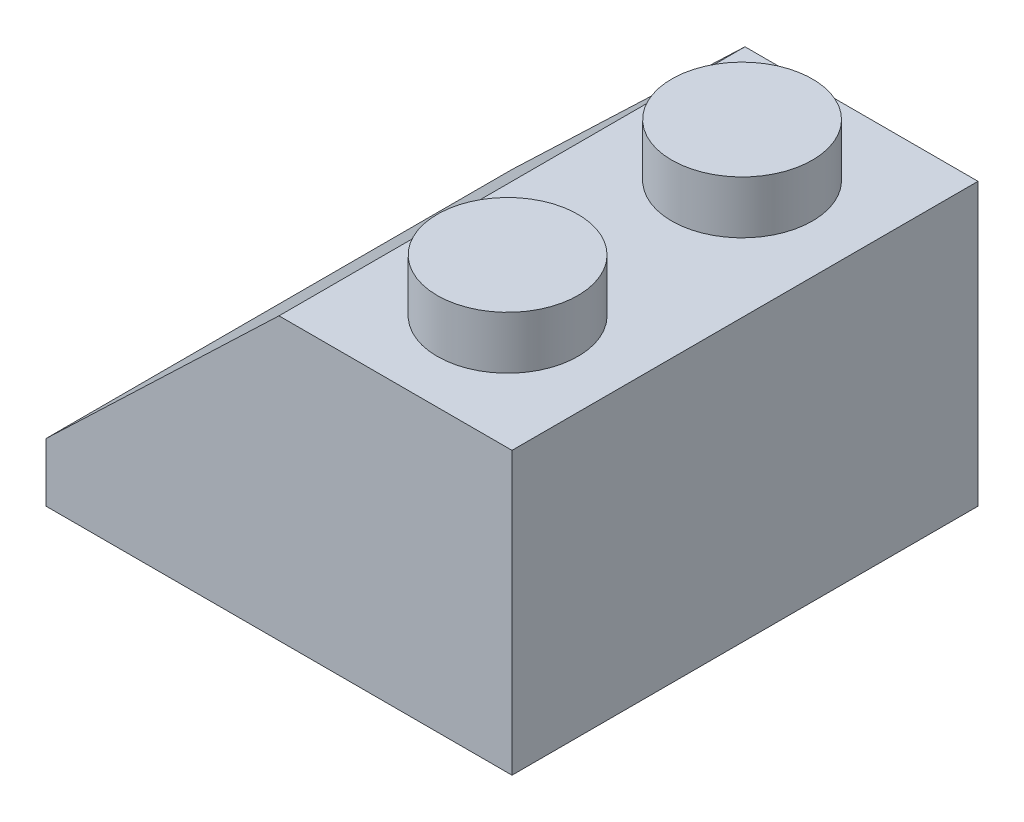
ISO-10303-21;
HEADER;
FILE_DESCRIPTION(('STEP AP214'),'2;1');
FILE_NAME('part.step','',(''),(''),'','','');
FILE_SCHEMA(('AUTOMOTIVE_DESIGN { 1 0 10303 214 1 1 1 1 }'));
ENDSEC;
DATA;
#1=APPLICATION_CONTEXT('core data for automotive mechanical design processes');
#2=APPLICATION_PROTOCOL_DEFINITION('international standard','automotive_design',2000,#1);
#3=PRODUCT_CONTEXT('',#1,'mechanical');
#4=PRODUCT('Part','Part','',(#3));
#5=PRODUCT_RELATED_PRODUCT_CATEGORY('part','',(#4));
#6=PRODUCT_DEFINITION_FORMATION('','',#4);
#7=PRODUCT_DEFINITION_CONTEXT('part definition',#1,'design');
#8=PRODUCT_DEFINITION('design','',#6,#7);
#9=PRODUCT_DEFINITION_SHAPE('','',#8);
#10=(LENGTH_UNIT() NAMED_UNIT(*) SI_UNIT(.MILLI.,.METRE.));
#11=(NAMED_UNIT(*) PLANE_ANGLE_UNIT() SI_UNIT($,.RADIAN.));
#12=(NAMED_UNIT(*) SI_UNIT($,.STERADIAN.) SOLID_ANGLE_UNIT());
#13=UNCERTAINTY_MEASURE_WITH_UNIT(LENGTH_MEASURE(1.E-05),#10,'distance_accuracy_value','');
#14=(GEOMETRIC_REPRESENTATION_CONTEXT(3) GLOBAL_UNCERTAINTY_ASSIGNED_CONTEXT((#13)) GLOBAL_UNIT_ASSIGNED_CONTEXT((#10,
#11,#12)) REPRESENTATION_CONTEXT('',''));
#15=CARTESIAN_POINT('',(0.,0.,0.));
#16=DIRECTION('',(0.,0.,1.));
#17=DIRECTION('',(1.,0.,0.));
#18=AXIS2_PLACEMENT_3D('',#15,#16,#17);
#19=CARTESIAN_POINT('',(0.,0.,-7.95));
#20=DIRECTION('',(0.,-1.,0.));
#21=DIRECTION('',(1.,0.,0.));
#22=AXIS2_PLACEMENT_3D('',#19,#20,#21);
#23=PLANE('',#22);
#24=DIRECTION('',(1.,0.,0.));
#25=VECTOR('',#24,1.);
#26=CARTESIAN_POINT('',(0.,0.,7.95));
#27=LINE('',#26,#25);
#28=CARTESIAN_POINT('',(-15.9,0.,7.95));
#29=VERTEX_POINT('',#28);
#30=CARTESIAN_POINT('',(0.,0.,7.95));
#31=VERTEX_POINT('',#30);
#32=EDGE_CURVE('E221',#29,#31,#27,.T.);
#33=ORIENTED_EDGE('',*,*,#32,.F.);
#34=DIRECTION('',(0.,0.,1.));
#35=VECTOR('',#34,1.);
#36=CARTESIAN_POINT('',(-15.9,0.,-7.95));
#37=LINE('',#36,#35);
#38=CARTESIAN_POINT('',(-15.9,0.,-7.95));
#39=VERTEX_POINT('',#38);
#40=EDGE_CURVE('E49',#39,#29,#37,.T.);
#41=ORIENTED_EDGE('',*,*,#40,.F.);
#42=DIRECTION('',(1.,0.,0.));
#43=VECTOR('',#42,1.);
#44=CARTESIAN_POINT('',(0.,0.,-7.95));
#45=LINE('',#44,#43);
#46=CARTESIAN_POINT('',(0.,0.,-7.95));
#47=VERTEX_POINT('',#46);
#48=EDGE_CURVE('E233',#39,#47,#45,.T.);
#49=ORIENTED_EDGE('',*,*,#48,.T.);
#50=DIRECTION('',(0.,0.,1.));
#51=VECTOR('',#50,1.);
#52=CARTESIAN_POINT('',(0.,0.,-7.95));
#53=LINE('',#52,#51);
#54=EDGE_CURVE('E11',#47,#31,#53,.T.);
#55=ORIENTED_EDGE('',*,*,#54,.T.);
#56=EDGE_LOOP('',(#33,#41,#49,#55));
#57=FACE_BOUND('',#56,.T.);
#58=DIRECTION('',(0.,0.,1.));
#59=VECTOR('',#58,1.);
#60=CARTESIAN_POINT('',(-15.4,0.,-7.95));
#61=LINE('',#60,#59);
#62=CARTESIAN_POINT('',(-15.4,0.,-7.45));
#63=VERTEX_POINT('',#62);
#64=CARTESIAN_POINT('',(-15.4,0.,7.45));
#65=VERTEX_POINT('',#64);
#66=EDGE_CURVE('E168',#63,#65,#61,.T.);
#67=ORIENTED_EDGE('',*,*,#66,.T.);
#68=DIRECTION('',(1.,0.,0.));
#69=VECTOR('',#68,1.);
#70=CARTESIAN_POINT('',(0.,0.,7.45));
#71=LINE('',#70,#69);
#72=CARTESIAN_POINT('',(-0.5,0.,7.45));
#73=VERTEX_POINT('',#72);
#74=EDGE_CURVE('E171',#65,#73,#71,.T.);
#75=ORIENTED_EDGE('',*,*,#74,.T.);
#76=DIRECTION('',(0.,0.,1.));
#77=VECTOR('',#76,1.);
#78=CARTESIAN_POINT('',(-0.5,0.,-7.95));
#79=LINE('',#78,#77);
#80=CARTESIAN_POINT('',(-0.5,0.,-7.45));
#81=VERTEX_POINT('',#80);
#82=EDGE_CURVE('E187',#81,#73,#79,.T.);
#83=ORIENTED_EDGE('',*,*,#82,.F.);
#84=DIRECTION('',(1.,0.,0.));
#85=VECTOR('',#84,1.);
#86=CARTESIAN_POINT('',(0.,0.,-7.45));
#87=LINE('',#86,#85);
#88=EDGE_CURVE('E175',#63,#81,#87,.T.);
#89=ORIENTED_EDGE('',*,*,#88,.F.);
#90=EDGE_LOOP('',(#67,#75,#83,#89));
#91=FACE_BOUND('',#90,.T.);
#92=ADVANCED_FACE('F39',(#57,#91),#23,.T.);
#93=CARTESIAN_POINT('',(0.,9.6,-7.95));
#94=DIRECTION('',(1.,0.,0.));
#95=DIRECTION('',(0.,1.,0.));
#96=AXIS2_PLACEMENT_3D('',#93,#94,#95);
#97=PLANE('',#96);
#98=DIRECTION('',(0.,1.,0.));
#99=VECTOR('',#98,1.);
#100=CARTESIAN_POINT('',(0.,9.6,7.95));
#101=LINE('',#100,#99);
#102=CARTESIAN_POINT('',(0.,9.6,7.95));
#103=VERTEX_POINT('',#102);
#104=EDGE_CURVE('E212',#31,#103,#101,.T.);
#105=ORIENTED_EDGE('',*,*,#104,.F.);
#106=ORIENTED_EDGE('',*,*,#54,.F.);
#107=DIRECTION('',(0.,1.,0.));
#108=VECTOR('',#107,1.);
#109=CARTESIAN_POINT('',(0.,9.6,-7.95));
#110=LINE('',#109,#108);
#111=CARTESIAN_POINT('',(0.,9.6,-7.95));
#112=VERTEX_POINT('',#111);
#113=EDGE_CURVE('E216',#47,#112,#110,.T.);
#114=ORIENTED_EDGE('',*,*,#113,.T.);
#115=DIRECTION('',(0.,0.,1.));
#116=VECTOR('',#115,1.);
#117=CARTESIAN_POINT('',(0.,9.6,-7.95));
#118=LINE('',#117,#116);
#119=EDGE_CURVE('E43',#112,#103,#118,.T.);
#120=ORIENTED_EDGE('',*,*,#119,.T.);
#121=EDGE_LOOP('',(#105,#106,#114,#120));
#122=FACE_BOUND('',#121,.T.);
#123=ADVANCED_FACE('F41',(#122),#97,.T.);
#124=CARTESIAN_POINT('',(-15.9,0.,-7.95));
#125=DIRECTION('',(-1.,0.,0.));
#126=DIRECTION('',(0.,0.,1.));
#127=AXIS2_PLACEMENT_3D('',#124,#125,#126);
#128=PLANE('',#127);
#129=DIRECTION('',(0.,-1.,0.));
#130=VECTOR('',#129,1.);
#131=CARTESIAN_POINT('',(-15.9,0.,7.95));
#132=LINE('',#131,#130);
#133=CARTESIAN_POINT('',(-15.9,2.,7.95));
#134=VERTEX_POINT('',#133);
#135=EDGE_CURVE('E248',#134,#29,#132,.T.);
#136=ORIENTED_EDGE('',*,*,#135,.F.);
#137=DIRECTION('',(0.,0.,1.));
#138=VECTOR('',#137,1.);
#139=CARTESIAN_POINT('',(-15.9,2.,-7.95));
#140=LINE('',#139,#138);
#141=CARTESIAN_POINT('',(-15.9,2.,-7.95));
#142=VERTEX_POINT('',#141);
#143=EDGE_CURVE('E257',#142,#134,#140,.T.);
#144=ORIENTED_EDGE('',*,*,#143,.F.);
#145=DIRECTION('',(0.,-1.,0.));
#146=VECTOR('',#145,1.);
#147=CARTESIAN_POINT('',(-15.9,0.,-7.95));
#148=LINE('',#147,#146);
#149=EDGE_CURVE('E229',#142,#39,#148,.T.);
#150=ORIENTED_EDGE('',*,*,#149,.T.);
#151=ORIENTED_EDGE('',*,*,#40,.T.);
#152=EDGE_LOOP('',(#136,#144,#150,#151));
#153=FACE_BOUND('',#152,.T.);
#154=ADVANCED_FACE('F284',(#153),#128,.T.);
#155=CARTESIAN_POINT('',(-15.9,2.,-7.95));
#156=DIRECTION('',(-0.691016178160011,0.722839291627906,0.));
#157=DIRECTION('',(-0.722839291627906,-0.691016178160011,0.));
#158=AXIS2_PLACEMENT_3D('',#155,#156,#157);
#159=PLANE('',#158);
#160=DIRECTION('',(-0.722839291627906,-0.691016178160011,0.));
#161=VECTOR('',#160,1.);
#162=CARTESIAN_POINT('',(-15.9,2.,7.95));
#163=LINE('',#162,#161);
#164=CARTESIAN_POINT('',(-7.95,9.6,7.95));
#165=VERTEX_POINT('',#164);
#166=EDGE_CURVE('E244',#165,#134,#163,.T.);
#167=ORIENTED_EDGE('',*,*,#166,.F.);
#168=DIRECTION('',(0.,0.,1.));
#169=VECTOR('',#168,1.);
#170=CARTESIAN_POINT('',(-7.95,9.6,-7.95));
#171=LINE('',#170,#169);
#172=CARTESIAN_POINT('',(-7.95,9.6,-7.95));
#173=VERTEX_POINT('',#172);
#174=EDGE_CURVE('E259',#173,#165,#171,.T.);
#175=ORIENTED_EDGE('',*,*,#174,.F.);
#176=DIRECTION('',(-0.722839291627906,-0.691016178160011,0.));
#177=VECTOR('',#176,1.);
#178=CARTESIAN_POINT('',(-15.9,2.,-7.95));
#179=LINE('',#178,#177);
#180=EDGE_CURVE('E225',#173,#142,#179,.T.);
#181=ORIENTED_EDGE('',*,*,#180,.T.);
#182=ORIENTED_EDGE('',*,*,#143,.T.);
#183=EDGE_LOOP('',(#167,#175,#181,#182));
#184=FACE_BOUND('',#183,.T.);
#185=ADVANCED_FACE('F282',(#184),#159,.T.);
#186=CARTESIAN_POINT('',(-7.95,9.6,-7.95));
#187=DIRECTION('',(0.,1.,0.));
#188=DIRECTION('',(0.,0.,1.));
#189=AXIS2_PLACEMENT_3D('',#186,#187,#188);
#190=PLANE('',#189);
#191=CARTESIAN_POINT('',(-4.05,9.6,-3.95));
#192=DIRECTION('',(0.,1.,0.));
#193=DIRECTION('',(0.,0.,1.));
#194=AXIS2_PLACEMENT_3D('',#191,#192,#193);
#195=CIRCLE('',#194,2.4);
#196=CARTESIAN_POINT('',(-4.05,9.6,-1.55));
#197=VERTEX_POINT('',#196);
#198=EDGE_CURVE('E190',#197,#197,#195,.T.);
#199=ORIENTED_EDGE('',*,*,#198,.F.);
#200=EDGE_LOOP('',(#199));
#201=FACE_BOUND('',#200,.T.);
#202=CARTESIAN_POINT('',(-4.05,9.6,4.05));
#203=DIRECTION('',(0.,1.,0.));
#204=DIRECTION('',(0.,0.,1.));
#205=AXIS2_PLACEMENT_3D('',#202,#203,#204);
#206=CIRCLE('',#205,2.4);
#207=CARTESIAN_POINT('',(-4.05,9.6,6.45));
#208=VERTEX_POINT('',#207);
#209=EDGE_CURVE('E207',#208,#208,#206,.T.);
#210=ORIENTED_EDGE('',*,*,#209,.F.);
#211=EDGE_LOOP('',(#210));
#212=FACE_BOUND('',#211,.T.);
#213=DIRECTION('',(-1.,0.,0.));
#214=VECTOR('',#213,1.);
#215=CARTESIAN_POINT('',(-7.95,9.6,7.95));
#216=LINE('',#215,#214);
#217=EDGE_CURVE('E240',#103,#165,#216,.T.);
#218=ORIENTED_EDGE('',*,*,#217,.F.);
#219=ORIENTED_EDGE('',*,*,#119,.F.);
#220=DIRECTION('',(-1.,0.,0.));
#221=VECTOR('',#220,1.);
#222=CARTESIAN_POINT('',(-7.95,9.6,-7.95));
#223=LINE('',#222,#221);
#224=EDGE_CURVE('E220',#112,#173,#223,.T.);
#225=ORIENTED_EDGE('',*,*,#224,.T.);
#226=ORIENTED_EDGE('',*,*,#174,.T.);
#227=EDGE_LOOP('',(#218,#219,#225,#226));
#228=FACE_BOUND('',#227,.T.);
#229=ADVANCED_FACE('F269',(#201,#212,#228),#190,.T.);
#230=CARTESIAN_POINT('',(0.,0.,-7.95));
#231=DIRECTION('',(0.,0.,-1.));
#232=DIRECTION('',(-1.,0.,0.));
#233=AXIS2_PLACEMENT_3D('',#230,#231,#232);
#234=PLANE('',#233);
#235=ORIENTED_EDGE('',*,*,#113,.F.);
#236=ORIENTED_EDGE('',*,*,#48,.F.);
#237=ORIENTED_EDGE('',*,*,#149,.F.);
#238=ORIENTED_EDGE('',*,*,#180,.F.);
#239=ORIENTED_EDGE('',*,*,#224,.F.);
#240=EDGE_LOOP('',(#235,#236,#237,#238,#239));
#241=FACE_BOUND('',#240,.T.);
#242=ADVANCED_FACE('F278',(#241),#234,.T.);
#243=CARTESIAN_POINT('',(0.,0.,7.95));
#244=DIRECTION('',(0.,0.,-1.));
#245=DIRECTION('',(-1.,0.,0.));
#246=AXIS2_PLACEMENT_3D('',#243,#244,#245);
#247=PLANE('',#246);
#248=ORIENTED_EDGE('',*,*,#104,.T.);
#249=ORIENTED_EDGE('',*,*,#217,.T.);
#250=ORIENTED_EDGE('',*,*,#166,.T.);
#251=ORIENTED_EDGE('',*,*,#135,.T.);
#252=ORIENTED_EDGE('',*,*,#32,.T.);
#253=EDGE_LOOP('',(#248,#249,#250,#251,#252));
#254=FACE_BOUND('',#253,.T.);
#255=ADVANCED_FACE('F271',(#254),#247,.F.);
#256=CARTESIAN_POINT('',(-4.05,11.4,4.05));
#257=DIRECTION('',(0.,-1.,0.));
#258=DIRECTION('',(0.,0.,-1.));
#259=AXIS2_PLACEMENT_3D('',#256,#257,#258);
#260=CYLINDRICAL_SURFACE('',#259,2.4);
#261=CARTESIAN_POINT('',(-4.05,11.4,4.05));
#262=DIRECTION('',(0.,1.,0.));
#263=DIRECTION('',(0.,0.,1.));
#264=AXIS2_PLACEMENT_3D('',#261,#262,#263);
#265=CIRCLE('',#264,2.4);
#266=CARTESIAN_POINT('',(-4.05,11.4,6.45));
#267=VERTEX_POINT('',#266);
#268=EDGE_CURVE('E208',#267,#267,#265,.T.);
#269=ORIENTED_EDGE('',*,*,#268,.F.);
#270=EDGE_LOOP('',(#269));
#271=FACE_BOUND('',#270,.T.);
#272=ORIENTED_EDGE('',*,*,#209,.T.);
#273=EDGE_LOOP('',(#272));
#274=FACE_BOUND('',#273,.T.);
#275=ADVANCED_FACE('F299',(#271,#274),#260,.T.);
#276=CARTESIAN_POINT('',(-4.05,11.4,4.05));
#277=DIRECTION('',(0.,1.,0.));
#278=DIRECTION('',(0.,0.,1.));
#279=AXIS2_PLACEMENT_3D('',#276,#277,#278);
#280=PLANE('',#279);
#281=ORIENTED_EDGE('',*,*,#268,.T.);
#282=EDGE_LOOP('',(#281));
#283=FACE_BOUND('',#282,.T.);
#284=ADVANCED_FACE('F304',(#283),#280,.T.);
#285=CARTESIAN_POINT('',(-4.05,11.4,-3.95));
#286=DIRECTION('',(0.,-1.,0.));
#287=DIRECTION('',(0.,0.,-1.));
#288=AXIS2_PLACEMENT_3D('',#285,#286,#287);
#289=CYLINDRICAL_SURFACE('',#288,2.4);
#290=CARTESIAN_POINT('',(-4.05,11.4,-3.95));
#291=DIRECTION('',(0.,1.,0.));
#292=DIRECTION('',(0.,0.,1.));
#293=AXIS2_PLACEMENT_3D('',#290,#291,#292);
#294=CIRCLE('',#293,2.4);
#295=CARTESIAN_POINT('',(-4.05,11.4,-1.55));
#296=VERTEX_POINT('',#295);
#297=EDGE_CURVE('E203',#296,#296,#294,.T.);
#298=ORIENTED_EDGE('',*,*,#297,.F.);
#299=EDGE_LOOP('',(#298));
#300=FACE_BOUND('',#299,.T.);
#301=ORIENTED_EDGE('',*,*,#198,.T.);
#302=EDGE_LOOP('',(#301));
#303=FACE_BOUND('',#302,.T.);
#304=ADVANCED_FACE('F308',(#300,#303),#289,.T.);
#305=CARTESIAN_POINT('',(-4.05,11.4,-3.95));
#306=DIRECTION('',(0.,1.,0.));
#307=DIRECTION('',(0.,0.,1.));
#308=AXIS2_PLACEMENT_3D('',#305,#306,#307);
#309=PLANE('',#308);
#310=ORIENTED_EDGE('',*,*,#297,.T.);
#311=EDGE_LOOP('',(#310));
#312=FACE_BOUND('',#311,.T.);
#313=ADVANCED_FACE('F312',(#312),#309,.T.);
#314=CARTESIAN_POINT('',(-0.5,9.6,-7.95));
#315=DIRECTION('',(1.,0.,0.));
#316=DIRECTION('',(0.,1.,0.));
#317=AXIS2_PLACEMENT_3D('',#314,#315,#316);
#318=PLANE('',#317);
#319=DIRECTION('',(0.,1.,0.));
#320=VECTOR('',#319,1.);
#321=CARTESIAN_POINT('',(-0.5,9.6,7.45));
#322=LINE('',#321,#320);
#323=CARTESIAN_POINT('',(-0.5,9.1,7.45));
#324=VERTEX_POINT('',#323);
#325=EDGE_CURVE('E180',#73,#324,#322,.T.);
#326=ORIENTED_EDGE('',*,*,#325,.T.);
#327=DIRECTION('',(0.,0.,1.));
#328=VECTOR('',#327,1.);
#329=CARTESIAN_POINT('',(-0.5,9.1,-7.95));
#330=LINE('',#329,#328);
#331=CARTESIAN_POINT('',(-0.5,9.1,-7.45));
#332=VERTEX_POINT('',#331);
#333=EDGE_CURVE('E150',#332,#324,#330,.T.);
#334=ORIENTED_EDGE('',*,*,#333,.F.);
#335=DIRECTION('',(0.,1.,0.));
#336=VECTOR('',#335,1.);
#337=CARTESIAN_POINT('',(-0.5,9.6,-7.45));
#338=LINE('',#337,#336);
#339=EDGE_CURVE('E194',#81,#332,#338,.T.);
#340=ORIENTED_EDGE('',*,*,#339,.F.);
#341=ORIENTED_EDGE('',*,*,#82,.T.);
#342=EDGE_LOOP('',(#326,#334,#340,#341));
#343=FACE_BOUND('',#342,.T.);
#344=ADVANCED_FACE('F316',(#343),#318,.F.);
#345=CARTESIAN_POINT('',(-15.4,0.,-7.95));
#346=DIRECTION('',(-1.,0.,0.));
#347=DIRECTION('',(0.,0.,1.));
#348=AXIS2_PLACEMENT_3D('',#345,#346,#347);
#349=PLANE('',#348);
#350=DIRECTION('',(0.,-1.,0.));
#351=VECTOR('',#350,1.);
#352=CARTESIAN_POINT('',(-15.4,0.,7.45));
#353=LINE('',#352,#351);
#354=CARTESIAN_POINT('',(-15.4,1.78627073443661,7.45));
#355=VERTEX_POINT('',#354);
#356=EDGE_CURVE('E159',#355,#65,#353,.T.);
#357=ORIENTED_EDGE('',*,*,#356,.T.);
#358=ORIENTED_EDGE('',*,*,#66,.F.);
#359=DIRECTION('',(0.,-1.,0.));
#360=VECTOR('',#359,1.);
#361=CARTESIAN_POINT('',(-15.4,0.,-7.45));
#362=LINE('',#361,#360);
#363=CARTESIAN_POINT('',(-15.4,1.78627073443661,-7.45));
#364=VERTEX_POINT('',#363);
#365=EDGE_CURVE('E165',#364,#63,#362,.T.);
#366=ORIENTED_EDGE('',*,*,#365,.F.);
#367=DIRECTION('',(0.,0.,1.));
#368=VECTOR('',#367,1.);
#369=CARTESIAN_POINT('',(-15.4,1.78627073443661,-7.95));
#370=LINE('',#369,#368);
#371=EDGE_CURVE('E149',#364,#355,#370,.T.);
#372=ORIENTED_EDGE('',*,*,#371,.T.);
#373=EDGE_LOOP('',(#357,#358,#366,#372));
#374=FACE_BOUND('',#373,.T.);
#375=ADVANCED_FACE('F349',(#374),#349,.F.);
#376=CARTESIAN_POINT('',(-15.55449191092,1.63858035418605,-7.95));
#377=DIRECTION('',(-0.691016178160011,0.722839291627906,0.));
#378=DIRECTION('',(-0.722839291627906,-0.691016178160011,0.));
#379=AXIS2_PLACEMENT_3D('',#376,#377,#378);
#380=PLANE('',#379);
#381=CARTESIAN_POINT('',(-8.05,8.81268582877623,0.0499999999999958));
#382=DIRECTION('',(-0.691016178160011,0.722839291627906,0.));
#383=DIRECTION('',(0.722839291627906,0.691016178160011,0.));
#384=AXIS2_PLACEMENT_3D('',#381,#382,#383);
#385=ELLIPSE('',#384,4.15030012168224,3.);
#386=CARTESIAN_POINT('',(-7.74945425510145,9.1,3.03490741149928));
#387=VERTEX_POINT('',#386);
#388=CARTESIAN_POINT('',(-7.74945425510145,9.1,-2.93490741149929));
#389=VERTEX_POINT('',#388);
#390=EDGE_CURVE('E139',#387,#389,#385,.F.);
#391=ORIENTED_EDGE('',*,*,#390,.F.);
#392=DIRECTION('',(0.,0.,1.));
#393=VECTOR('',#392,1.);
#394=CARTESIAN_POINT('',(-7.74945425510145,9.1,-7.95));
#395=LINE('',#394,#393);
#396=CARTESIAN_POINT('',(-7.74945425510145,9.1,7.45));
#397=VERTEX_POINT('',#396);
#398=EDGE_CURVE('E145',#387,#397,#395,.T.);
#399=ORIENTED_EDGE('',*,*,#398,.T.);
#400=DIRECTION('',(-0.722839291627906,-0.691016178160011,0.));
#401=VECTOR('',#400,1.);
#402=CARTESIAN_POINT('',(-15.55449191092,1.63858035418605,7.45));
#403=LINE('',#402,#401);
#404=EDGE_CURVE('E155',#397,#355,#403,.T.);
#405=ORIENTED_EDGE('',*,*,#404,.T.);
#406=ORIENTED_EDGE('',*,*,#371,.F.);
#407=DIRECTION('',(-0.722839291627906,-0.691016178160011,0.));
#408=VECTOR('',#407,1.);
#409=CARTESIAN_POINT('',(-15.55449191092,1.63858035418605,-7.45));
#410=LINE('',#409,#408);
#411=CARTESIAN_POINT('',(-7.74945425510145,9.1,-7.45));
#412=VERTEX_POINT('',#411);
#413=EDGE_CURVE('E161',#412,#364,#410,.T.);
#414=ORIENTED_EDGE('',*,*,#413,.F.);
#415=EDGE_CURVE('E144',#412,#389,#395,.T.);
#416=ORIENTED_EDGE('',*,*,#415,.T.);
#417=EDGE_LOOP('',(#391,#399,#405,#406,#414,#416));
#418=FACE_BOUND('',#417,.T.);
#419=ADVANCED_FACE('F346',(#418),#380,.F.);
#420=CARTESIAN_POINT('',(-7.95,9.1,-7.95));
#421=DIRECTION('',(0.,1.,0.));
#422=DIRECTION('',(0.,0.,1.));
#423=AXIS2_PLACEMENT_3D('',#420,#421,#422);
#424=PLANE('',#423);
#425=CARTESIAN_POINT('',(-8.05,9.1,0.0499999999999958));
#426=DIRECTION('',(0.,-1.,0.));
#427=DIRECTION('',(0.,0.,-1.));
#428=AXIS2_PLACEMENT_3D('',#425,#426,#427);
#429=CIRCLE('',#428,3.);
#430=EDGE_CURVE('E64',#389,#387,#429,.T.);
#431=ORIENTED_EDGE('',*,*,#430,.F.);
#432=ORIENTED_EDGE('',*,*,#415,.F.);
#433=DIRECTION('',(-1.,0.,0.));
#434=VECTOR('',#433,1.);
#435=CARTESIAN_POINT('',(-7.95,9.1,-7.45));
#436=LINE('',#435,#434);
#437=EDGE_CURVE('E153',#332,#412,#436,.T.);
#438=ORIENTED_EDGE('',*,*,#437,.F.);
#439=ORIENTED_EDGE('',*,*,#333,.T.);
#440=DIRECTION('',(-1.,0.,0.));
#441=VECTOR('',#440,1.);
#442=CARTESIAN_POINT('',(-7.95,9.1,7.45));
#443=LINE('',#442,#441);
#444=EDGE_CURVE('E160',#324,#397,#443,.T.);
#445=ORIENTED_EDGE('',*,*,#444,.T.);
#446=ORIENTED_EDGE('',*,*,#398,.F.);
#447=EDGE_LOOP('',(#431,#432,#438,#439,#445,#446));
#448=FACE_BOUND('',#447,.T.);
#449=CARTESIAN_POINT('',(-4.05,9.1,-3.95));
#450=DIRECTION('',(0.,1.,0.));
#451=DIRECTION('',(0.,0.,1.));
#452=AXIS2_PLACEMENT_3D('',#449,#450,#451);
#453=CIRCLE('',#452,1.9);
#454=CARTESIAN_POINT('',(-4.05,9.1,-2.05));
#455=VERTEX_POINT('',#454);
#456=EDGE_CURVE('E186',#455,#455,#453,.T.);
#457=ORIENTED_EDGE('',*,*,#456,.T.);
#458=EDGE_LOOP('',(#457));
#459=FACE_BOUND('',#458,.T.);
#460=CARTESIAN_POINT('',(-4.05,9.1,4.05));
#461=DIRECTION('',(0.,1.,0.));
#462=DIRECTION('',(0.,0.,1.));
#463=AXIS2_PLACEMENT_3D('',#460,#461,#462);
#464=CIRCLE('',#463,1.9);
#465=CARTESIAN_POINT('',(-4.05,9.1,5.95));
#466=VERTEX_POINT('',#465);
#467=EDGE_CURVE('E181',#466,#466,#464,.T.);
#468=ORIENTED_EDGE('',*,*,#467,.T.);
#469=EDGE_LOOP('',(#468));
#470=FACE_BOUND('',#469,.T.);
#471=ADVANCED_FACE('F342',(#448,#459,#470),#424,.F.);
#472=CARTESIAN_POINT('',(0.,0.,-7.45));
#473=DIRECTION('',(0.,0.,-1.));
#474=DIRECTION('',(-1.,0.,0.));
#475=AXIS2_PLACEMENT_3D('',#472,#473,#474);
#476=PLANE('',#475);
#477=ORIENTED_EDGE('',*,*,#339,.T.);
#478=ORIENTED_EDGE('',*,*,#437,.T.);
#479=ORIENTED_EDGE('',*,*,#413,.T.);
#480=ORIENTED_EDGE('',*,*,#365,.T.);
#481=ORIENTED_EDGE('',*,*,#88,.T.);
#482=EDGE_LOOP('',(#477,#478,#479,#480,#481));
#483=FACE_BOUND('',#482,.T.);
#484=ADVANCED_FACE('F338',(#483),#476,.F.);
#485=CARTESIAN_POINT('',(0.,0.,7.45));
#486=DIRECTION('',(0.,0.,-1.));
#487=DIRECTION('',(-1.,0.,0.));
#488=AXIS2_PLACEMENT_3D('',#485,#486,#487);
#489=PLANE('',#488);
#490=ORIENTED_EDGE('',*,*,#325,.F.);
#491=ORIENTED_EDGE('',*,*,#74,.F.);
#492=ORIENTED_EDGE('',*,*,#356,.F.);
#493=ORIENTED_EDGE('',*,*,#404,.F.);
#494=ORIENTED_EDGE('',*,*,#444,.F.);
#495=EDGE_LOOP('',(#490,#491,#492,#493,#494));
#496=FACE_BOUND('',#495,.T.);
#497=ADVANCED_FACE('F334',(#496),#489,.T.);
#498=CARTESIAN_POINT('',(-4.05,11.4,4.05));
#499=DIRECTION('',(0.,-1.,0.));
#500=DIRECTION('',(0.,0.,-1.));
#501=AXIS2_PLACEMENT_3D('',#498,#499,#500);
#502=CYLINDRICAL_SURFACE('',#501,1.9);
#503=CARTESIAN_POINT('',(-4.05,10.9,4.05));
#504=DIRECTION('',(0.,1.,0.));
#505=DIRECTION('',(0.,0.,1.));
#506=AXIS2_PLACEMENT_3D('',#503,#504,#505);
#507=CIRCLE('',#506,1.9);
#508=CARTESIAN_POINT('',(-4.05,10.9,5.95));
#509=VERTEX_POINT('',#508);
#510=EDGE_CURVE('E176',#509,#509,#507,.T.);
#511=ORIENTED_EDGE('',*,*,#510,.T.);
#512=EDGE_LOOP('',(#511));
#513=FACE_BOUND('',#512,.T.);
#514=ORIENTED_EDGE('',*,*,#467,.F.);
#515=EDGE_LOOP('',(#514));
#516=FACE_BOUND('',#515,.T.);
#517=ADVANCED_FACE('F330',(#513,#516),#502,.F.);
#518=CARTESIAN_POINT('',(-4.05,10.9,4.05));
#519=DIRECTION('',(0.,1.,0.));
#520=DIRECTION('',(0.,0.,1.));
#521=AXIS2_PLACEMENT_3D('',#518,#519,#520);
#522=PLANE('',#521);
#523=ORIENTED_EDGE('',*,*,#510,.F.);
#524=EDGE_LOOP('',(#523));
#525=FACE_BOUND('',#524,.T.);
#526=ADVANCED_FACE('F326',(#525),#522,.F.);
#527=CARTESIAN_POINT('',(-4.05,11.4,-3.95));
#528=DIRECTION('',(0.,-1.,0.));
#529=DIRECTION('',(0.,0.,-1.));
#530=AXIS2_PLACEMENT_3D('',#527,#528,#529);
#531=CYLINDRICAL_SURFACE('',#530,1.9);
#532=CARTESIAN_POINT('',(-4.05,10.9,-3.95));
#533=DIRECTION('',(0.,1.,0.));
#534=DIRECTION('',(0.,0.,1.));
#535=AXIS2_PLACEMENT_3D('',#532,#533,#534);
#536=CIRCLE('',#535,1.9);
#537=CARTESIAN_POINT('',(-4.05,10.9,-2.05));
#538=VERTEX_POINT('',#537);
#539=EDGE_CURVE('E182',#538,#538,#536,.T.);
#540=ORIENTED_EDGE('',*,*,#539,.T.);
#541=EDGE_LOOP('',(#540));
#542=FACE_BOUND('',#541,.T.);
#543=ORIENTED_EDGE('',*,*,#456,.F.);
#544=EDGE_LOOP('',(#543));
#545=FACE_BOUND('',#544,.T.);
#546=ADVANCED_FACE('F322',(#542,#545),#531,.F.);
#547=CARTESIAN_POINT('',(-4.05,10.9,-3.95));
#548=DIRECTION('',(0.,1.,0.));
#549=DIRECTION('',(0.,0.,1.));
#550=AXIS2_PLACEMENT_3D('',#547,#548,#549);
#551=PLANE('',#550);
#552=ORIENTED_EDGE('',*,*,#539,.F.);
#553=EDGE_LOOP('',(#552));
#554=FACE_BOUND('',#553,.T.);
#555=ADVANCED_FACE('F318',(#554),#551,.F.);
#556=CARTESIAN_POINT('',(0.,0.,-7.95));
#557=DIRECTION('',(0.,-1.,0.));
#558=DIRECTION('',(1.,0.,0.));
#559=AXIS2_PLACEMENT_3D('',#556,#557,#558);
#560=PLANE('',#559);
#561=CARTESIAN_POINT('',(-8.05,0.,0.0499999999999958));
#562=DIRECTION('',(0.,-1.,0.));
#563=DIRECTION('',(1.,0.,0.));
#564=AXIS2_PLACEMENT_3D('',#561,#562,#563);
#565=CIRCLE('',#564,2.4);
#566=CARTESIAN_POINT('',(-5.65,0.,0.0499999999999958));
#567=VERTEX_POINT('',#566);
#568=EDGE_CURVE('E133',#567,#567,#565,.T.);
#569=ORIENTED_EDGE('',*,*,#568,.F.);
#570=EDGE_LOOP('',(#569));
#571=FACE_BOUND('',#570,.T.);
#572=CARTESIAN_POINT('',(-8.05,0.,0.0499999999999958));
#573=DIRECTION('',(0.,-1.,0.));
#574=DIRECTION('',(1.,0.,0.));
#575=AXIS2_PLACEMENT_3D('',#572,#573,#574);
#576=CIRCLE('',#575,3.);
#577=CARTESIAN_POINT('',(-5.05,0.,0.0499999999999958));
#578=VERTEX_POINT('',#577);
#579=EDGE_CURVE('E140',#578,#578,#576,.T.);
#580=ORIENTED_EDGE('',*,*,#579,.T.);
#581=EDGE_LOOP('',(#580));
#582=FACE_BOUND('',#581,.T.);
#583=ADVANCED_FACE('F321',(#571,#582),#560,.T.);
#584=CARTESIAN_POINT('',(-8.05,-8.48528137423858,0.0499999999999958));
#585=DIRECTION('',(0.,1.,0.));
#586=DIRECTION('',(0.,0.,1.));
#587=AXIS2_PLACEMENT_3D('',#584,#585,#586);
#588=CYLINDRICAL_SURFACE('',#587,2.4);
#589=ORIENTED_EDGE('',*,*,#568,.T.);
#590=EDGE_LOOP('',(#589));
#591=FACE_BOUND('',#590,.T.);
#592=CARTESIAN_POINT('',(-8.05,8.81268582877623,0.0499999999999958));
#593=DIRECTION('',(-0.691016178160011,0.722839291627906,0.));
#594=DIRECTION('',(0.722839291627906,0.691016178160011,0.));
#595=AXIS2_PLACEMENT_3D('',#592,#593,#594);
#596=ELLIPSE('',#595,3.32024009734579,2.4);
#597=CARTESIAN_POINT('',(-7.74945425510145,9.1,2.43110735902927));
#598=VERTEX_POINT('',#597);
#599=CARTESIAN_POINT('',(-7.74945425510145,9.1,-2.33110735902928));
#600=VERTEX_POINT('',#599);
#601=EDGE_CURVE('E56',#598,#600,#596,.F.);
#602=ORIENTED_EDGE('',*,*,#601,.F.);
#603=CARTESIAN_POINT('',(-8.05,9.1,0.0499999999999958));
#604=DIRECTION('',(0.,-1.,0.));
#605=DIRECTION('',(0.,0.,-1.));
#606=AXIS2_PLACEMENT_3D('',#603,#604,#605);
#607=CIRCLE('',#606,2.4);
#608=EDGE_CURVE('E127',#600,#598,#607,.T.);
#609=ORIENTED_EDGE('',*,*,#608,.F.);
#610=EDGE_LOOP('',(#602,#609));
#611=FACE_BOUND('',#610,.T.);
#612=ADVANCED_FACE('F128',(#591,#611),#588,.F.);
#613=CARTESIAN_POINT('',(-8.05,-8.48528137423858,0.0499999999999958));
#614=DIRECTION('',(0.,1.,0.));
#615=DIRECTION('',(0.,0.,1.));
#616=AXIS2_PLACEMENT_3D('',#613,#614,#615);
#617=CYLINDRICAL_SURFACE('',#616,3.);
#618=ORIENTED_EDGE('',*,*,#579,.F.);
#619=EDGE_LOOP('',(#618));
#620=FACE_BOUND('',#619,.T.);
#621=ORIENTED_EDGE('',*,*,#430,.T.);
#622=ORIENTED_EDGE('',*,*,#390,.T.);
#623=EDGE_LOOP('',(#621,#622));
#624=FACE_BOUND('',#623,.T.);
#625=ADVANCED_FACE('F357',(#620,#624),#617,.T.);
#626=EDGE_CURVE('E137',#600,#598,#395,.T.);
#627=ORIENTED_EDGE('',*,*,#626,.F.);
#628=ORIENTED_EDGE('',*,*,#608,.T.);
#629=EDGE_LOOP('',(#627,#628));
#630=FACE_BOUND('',#629,.T.);
#631=ADVANCED_FACE('F142',(#630),#424,.F.);
#632=ORIENTED_EDGE('',*,*,#626,.T.);
#633=ORIENTED_EDGE('',*,*,#601,.T.);
#634=EDGE_LOOP('',(#632,#633));
#635=FACE_BOUND('',#634,.T.);
#636=ADVANCED_FACE('F136',(#635),#380,.F.);
#637=CLOSED_SHELL('',(#92,#123,#154,#185,#229,#242,#255,#275,#284,#304,#313,#344,#375,#419,#471,
#484,#497,#517,#526,#546,#555,#583,#612,#625,#631,#636));
#638=MANIFOLD_SOLID_BREP('B2',#637);
#639=ADVANCED_BREP_SHAPE_REPRESENTATION('',(#18,#638),#14);
#640=SHAPE_DEFINITION_REPRESENTATION(#9,#639);
ENDSEC;
END-ISO-10303-21;
